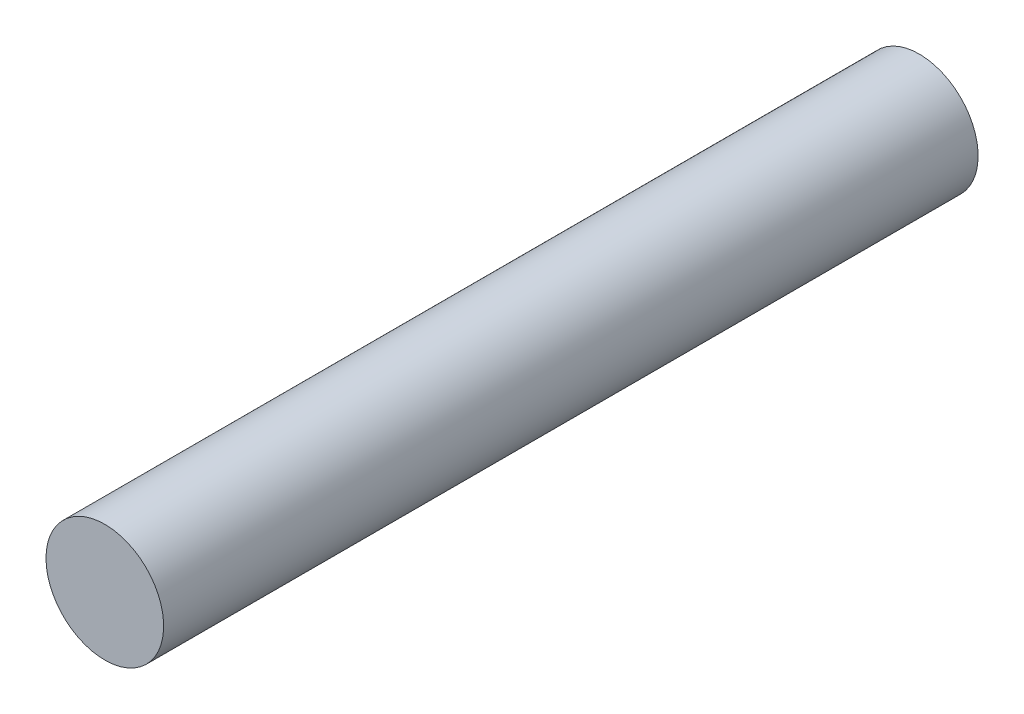
ISO-10303-21;
HEADER;
FILE_DESCRIPTION(('STEP AP214'),'2;1');
FILE_NAME('part.step','',(''),(''),'','','');
FILE_SCHEMA(('AUTOMOTIVE_DESIGN { 1 0 10303 214 1 1 1 1 }'));
ENDSEC;
DATA;
#1=APPLICATION_CONTEXT('core data for automotive mechanical design processes');
#2=APPLICATION_PROTOCOL_DEFINITION('international standard','automotive_design',2000,#1);
#3=PRODUCT_CONTEXT('',#1,'mechanical');
#4=PRODUCT('Part','Part','',(#3));
#5=PRODUCT_RELATED_PRODUCT_CATEGORY('part','',(#4));
#6=PRODUCT_DEFINITION_FORMATION('','',#4);
#7=PRODUCT_DEFINITION_CONTEXT('part definition',#1,'design');
#8=PRODUCT_DEFINITION('design','',#6,#7);
#9=PRODUCT_DEFINITION_SHAPE('','',#8);
#10=(LENGTH_UNIT() NAMED_UNIT(*) SI_UNIT(.MILLI.,.METRE.));
#11=(NAMED_UNIT(*) PLANE_ANGLE_UNIT() SI_UNIT($,.RADIAN.));
#12=(NAMED_UNIT(*) SI_UNIT($,.STERADIAN.) SOLID_ANGLE_UNIT());
#13=UNCERTAINTY_MEASURE_WITH_UNIT(LENGTH_MEASURE(1.E-05),#10,'distance_accuracy_value','');
#14=(GEOMETRIC_REPRESENTATION_CONTEXT(3) GLOBAL_UNCERTAINTY_ASSIGNED_CONTEXT((#13)) GLOBAL_UNIT_ASSIGNED_CONTEXT((#10,
#11,#12)) REPRESENTATION_CONTEXT('',''));
#15=CARTESIAN_POINT('',(0.,0.,0.));
#16=DIRECTION('',(0.,0.,1.));
#17=DIRECTION('',(1.,0.,0.));
#18=AXIS2_PLACEMENT_3D('',#15,#16,#17);
#19=CARTESIAN_POINT('',(0.,0.,90.));
#20=DIRECTION('',(0.,0.,-1.));
#21=DIRECTION('',(-1.,0.,0.));
#22=AXIS2_PLACEMENT_3D('',#19,#20,#21);
#23=CYLINDRICAL_SURFACE('',#22,6.5);
#24=CARTESIAN_POINT('',(0.,0.,90.));
#25=DIRECTION('',(0.,0.,1.));
#26=DIRECTION('',(1.,0.,0.));
#27=AXIS2_PLACEMENT_3D('',#24,#25,#26);
#28=CIRCLE('',#27,6.5);
#29=CARTESIAN_POINT('',(-6.5,0.,90.));
#30=VERTEX_POINT('',#29);
#31=EDGE_CURVE('E10',#30,#30,#28,.T.);
#32=CARTESIAN_POINT('',(0.,0.,0.));
#33=DIRECTION('',(0.,0.,1.));
#34=DIRECTION('',(1.,0.,0.));
#35=AXIS2_PLACEMENT_3D('',#32,#33,#34);
#36=CIRCLE('',#35,6.5);
#37=CARTESIAN_POINT('',(-6.5,0.,0.));
#38=VERTEX_POINT('',#37);
#39=EDGE_CURVE('E46',#38,#38,#36,.T.);
#40=CARTESIAN_POINT('',(-6.5,0.,90.));
#41=CARTESIAN_POINT('',(-6.5,0.,89.0625));
#42=CARTESIAN_POINT('',(-6.5,0.,88.125));
#43=CARTESIAN_POINT('',(-6.5,0.,86.25));
#44=CARTESIAN_POINT('',(-6.5,0.,85.3125));
#45=CARTESIAN_POINT('',(-6.5,0.,83.4375));
#46=CARTESIAN_POINT('',(-6.5,0.,82.5));
#47=CARTESIAN_POINT('',(-6.5,0.,80.625));
#48=CARTESIAN_POINT('',(-6.5,0.,79.6875));
#49=CARTESIAN_POINT('',(-6.5,0.,77.8125));
#50=CARTESIAN_POINT('',(-6.5,0.,76.875));
#51=CARTESIAN_POINT('',(-6.5,0.,75.));
#52=CARTESIAN_POINT('',(-6.5,0.,74.0625));
#53=CARTESIAN_POINT('',(-6.5,0.,72.1875));
#54=CARTESIAN_POINT('',(-6.5,0.,71.25));
#55=CARTESIAN_POINT('',(-6.5,0.,69.375));
#56=CARTESIAN_POINT('',(-6.5,0.,68.4375));
#57=CARTESIAN_POINT('',(-6.5,0.,66.5625));
#58=CARTESIAN_POINT('',(-6.5,0.,65.625));
#59=CARTESIAN_POINT('',(-6.5,0.,63.75));
#60=CARTESIAN_POINT('',(-6.5,0.,62.8125));
#61=CARTESIAN_POINT('',(-6.5,0.,60.9375));
#62=CARTESIAN_POINT('',(-6.5,0.,60.));
#63=CARTESIAN_POINT('',(-6.5,0.,58.125));
#64=CARTESIAN_POINT('',(-6.5,0.,57.1875));
#65=CARTESIAN_POINT('',(-6.5,0.,55.3125));
#66=CARTESIAN_POINT('',(-6.5,0.,54.375));
#67=CARTESIAN_POINT('',(-6.5,0.,52.5));
#68=CARTESIAN_POINT('',(-6.5,0.,51.5625));
#69=CARTESIAN_POINT('',(-6.5,0.,49.6875));
#70=CARTESIAN_POINT('',(-6.5,0.,48.75));
#71=CARTESIAN_POINT('',(-6.5,0.,46.875));
#72=CARTESIAN_POINT('',(-6.5,0.,45.9375));
#73=CARTESIAN_POINT('',(-6.5,0.,44.0625));
#74=CARTESIAN_POINT('',(-6.5,0.,43.125));
#75=CARTESIAN_POINT('',(-6.5,0.,41.25));
#76=CARTESIAN_POINT('',(-6.5,0.,40.3125));
#77=CARTESIAN_POINT('',(-6.5,0.,38.4375));
#78=CARTESIAN_POINT('',(-6.5,0.,37.5));
#79=CARTESIAN_POINT('',(-6.5,0.,35.625));
#80=CARTESIAN_POINT('',(-6.5,0.,34.6875));
#81=CARTESIAN_POINT('',(-6.5,0.,32.8125));
#82=CARTESIAN_POINT('',(-6.5,0.,31.875));
#83=CARTESIAN_POINT('',(-6.5,0.,30.));
#84=CARTESIAN_POINT('',(-6.5,0.,29.0625));
#85=CARTESIAN_POINT('',(-6.5,0.,27.1875));
#86=CARTESIAN_POINT('',(-6.5,0.,26.25));
#87=CARTESIAN_POINT('',(-6.5,0.,24.375));
#88=CARTESIAN_POINT('',(-6.5,0.,23.4375));
#89=CARTESIAN_POINT('',(-6.5,0.,21.5625));
#90=CARTESIAN_POINT('',(-6.5,0.,20.625));
#91=CARTESIAN_POINT('',(-6.5,0.,18.75));
#92=CARTESIAN_POINT('',(-6.5,0.,17.8125));
#93=CARTESIAN_POINT('',(-6.5,0.,15.9375));
#94=CARTESIAN_POINT('',(-6.5,0.,15.));
#95=CARTESIAN_POINT('',(-6.5,0.,13.125));
#96=CARTESIAN_POINT('',(-6.5,0.,12.1875));
#97=CARTESIAN_POINT('',(-6.5,0.,10.3125));
#98=CARTESIAN_POINT('',(-6.5,0.,9.37499999999999));
#99=CARTESIAN_POINT('',(-6.5,0.,7.49999999999999));
#100=CARTESIAN_POINT('',(-6.5,0.,6.56249999999999));
#101=CARTESIAN_POINT('',(-6.5,0.,4.68749999999999));
#102=CARTESIAN_POINT('',(-6.5,0.,3.74999999999998));
#103=CARTESIAN_POINT('',(-6.5,0.,1.87499999999998));
#104=CARTESIAN_POINT('',(-6.5,0.,0.937499999999986));
#105=CARTESIAN_POINT('',(-6.5,0.,0.));
#106=B_SPLINE_CURVE_WITH_KNOTS('',3,(#40,#41,#42,#43,#44,#45,#46,#47,#48,#49,#50,#51,#52,#53,
#54,#55,#56,#57,#58,#59,#60,#61,#62,#63,#64,#65,#66,#67,#68,#69,#70,#71,#72,#73,#74,#75,#76,#77,
#78,#79,#80,#81,#82,#83,#84,#85,#86,#87,#88,#89,#90,#91,#92,#93,#94,#95,#96,#97,#98,#99,#100,
#101,#102,#103,#104,#105),.UNSPECIFIED.,.F.,.F.,(4,2,2,2,2,2,2,2,2,2,2,2,2,2,2,2,2,2,2,2,2,2,2,
2,2,2,2,2,2,2,2,2,4),(0.,2.81250000000001,5.62500000000001,8.43750000000001,11.25,14.0625,
16.875,19.6875,22.5,25.3125,28.125,30.9375,33.75,36.5625,39.375,42.1875,45.,47.8125,50.625,
53.4375,56.25,59.0625,61.875,64.6875,67.5,70.3125,73.125,75.9375,78.75,81.5625,84.375,87.1875,
90.),.UNSPECIFIED.);
#107=EDGE_CURVE('BSEAM43',#30,#38,#106,.T.);
#108=ORIENTED_EDGE('',*,*,#31,.F.);
#109=ORIENTED_EDGE('',*,*,#39,.T.);
#110=ORIENTED_EDGE('',*,*,#107,.T.);
#111=ORIENTED_EDGE('',*,*,#107,.F.);
#112=EDGE_LOOP('',(#108,#110,#109,#111));
#113=FACE_BOUND('',#112,.T.);
#114=ADVANCED_FACE('F43',(#113),#23,.T.);
#115=CARTESIAN_POINT('',(0.,0.,90.));
#116=DIRECTION('',(0.,0.,1.));
#117=DIRECTION('',(1.,0.,0.));
#118=AXIS2_PLACEMENT_3D('',#115,#116,#117);
#119=PLANE('',#118);
#120=ORIENTED_EDGE('',*,*,#31,.T.);
#121=EDGE_LOOP('',(#120));
#122=FACE_BOUND('',#121,.T.);
#123=ADVANCED_FACE('F58',(#122),#119,.T.);
#124=CARTESIAN_POINT('',(0.,0.,0.));
#125=DIRECTION('',(0.,0.,1.));
#126=DIRECTION('',(1.,0.,0.));
#127=AXIS2_PLACEMENT_3D('',#124,#125,#126);
#128=PLANE('',#127);
#129=ORIENTED_EDGE('',*,*,#39,.F.);
#130=EDGE_LOOP('',(#129));
#131=FACE_BOUND('',#130,.T.);
#132=ADVANCED_FACE('F56',(#131),#128,.F.);
#133=CLOSED_SHELL('',(#114,#123,#132));
#134=MANIFOLD_SOLID_BREP('B2',#133);
#135=ADVANCED_BREP_SHAPE_REPRESENTATION('',(#18,#134),#14);
#136=SHAPE_DEFINITION_REPRESENTATION(#9,#135);
ENDSEC;
END-ISO-10303-21;
